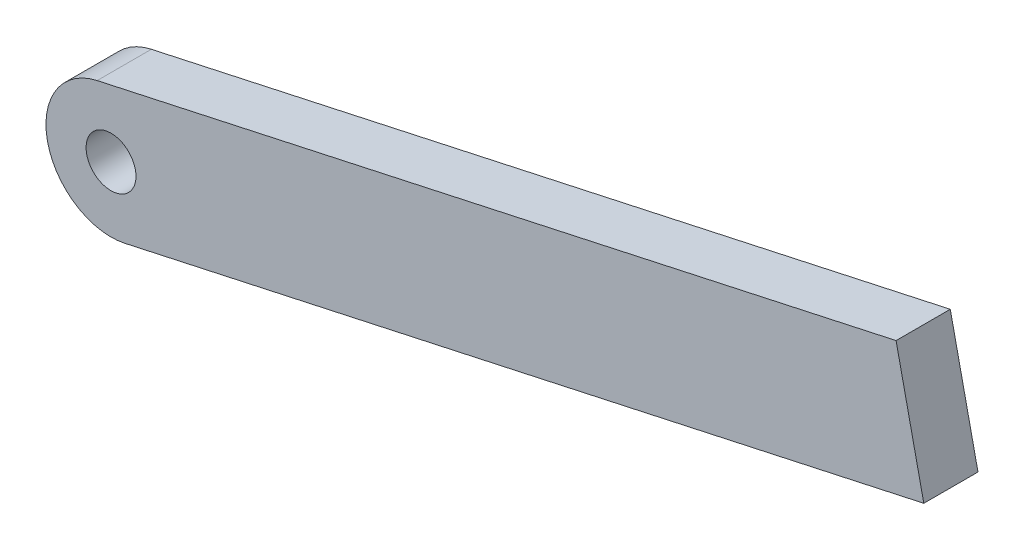
ISO-10303-21;
HEADER;
FILE_DESCRIPTION(('STEP AP214'),'2;1');
FILE_NAME('part.step','',(''),(''),'','','');
FILE_SCHEMA(('AUTOMOTIVE_DESIGN { 1 0 10303 214 1 1 1 1 }'));
ENDSEC;
DATA;
#1=APPLICATION_CONTEXT('core data for automotive mechanical design processes');
#2=APPLICATION_PROTOCOL_DEFINITION('international standard','automotive_design',2000,#1);
#3=PRODUCT_CONTEXT('',#1,'mechanical');
#4=PRODUCT('Part','Part','',(#3));
#5=PRODUCT_RELATED_PRODUCT_CATEGORY('part','',(#4));
#6=PRODUCT_DEFINITION_FORMATION('','',#4);
#7=PRODUCT_DEFINITION_CONTEXT('part definition',#1,'design');
#8=PRODUCT_DEFINITION('design','',#6,#7);
#9=PRODUCT_DEFINITION_SHAPE('','',#8);
#10=(LENGTH_UNIT() NAMED_UNIT(*) SI_UNIT(.MILLI.,.METRE.));
#11=(NAMED_UNIT(*) PLANE_ANGLE_UNIT() SI_UNIT($,.RADIAN.));
#12=(NAMED_UNIT(*) SI_UNIT($,.STERADIAN.) SOLID_ANGLE_UNIT());
#13=UNCERTAINTY_MEASURE_WITH_UNIT(LENGTH_MEASURE(1.E-05),#10,'distance_accuracy_value','');
#14=(GEOMETRIC_REPRESENTATION_CONTEXT(3) GLOBAL_UNCERTAINTY_ASSIGNED_CONTEXT((#13)) GLOBAL_UNIT_ASSIGNED_CONTEXT((#10,
#11,#12)) REPRESENTATION_CONTEXT('',''));
#15=CARTESIAN_POINT('',(0.,0.,0.));
#16=DIRECTION('',(0.,0.,1.));
#17=DIRECTION('',(1.,0.,0.));
#18=AXIS2_PLACEMENT_3D('',#15,#16,#17);
#19=CARTESIAN_POINT('',(194.487096888377,10.5650547502715,3.175));
#20=DIRECTION('',(-0.213148789764073,0.977019750784042,0.));
#21=DIRECTION('',(-0.977019750784042,-0.213148789764073,0.));
#22=AXIS2_PLACEMENT_3D('',#19,#20,#21);
#23=PLANE('',#22);
#24=DIRECTION('',(0.977019750784042,0.213148789764073,0.));
#25=VECTOR('',#24,1.);
#26=CARTESIAN_POINT('',(194.487096888377,10.5650547502715,0.));
#27=LINE('',#26,#25);
#28=CARTESIAN_POINT('',(194.487096888377,10.5650547502715,0.));
#29=VERTEX_POINT('',#28);
#30=CARTESIAN_POINT('',(241.287043977709,20.7750347175226,0.));
#31=VERTEX_POINT('',#30);
#32=EDGE_CURVE('E111',#29,#31,#27,.T.);
#33=ORIENTED_EDGE('',*,*,#32,.T.);
#34=DIRECTION('',(0.,0.,-1.));
#35=VECTOR('',#34,1.);
#36=CARTESIAN_POINT('',(241.287043977709,20.7750347175226,3.175));
#37=LINE('',#36,#35);
#38=CARTESIAN_POINT('',(241.287043977709,20.7750347175226,3.175));
#39=VERTEX_POINT('',#38);
#40=EDGE_CURVE('E64',#39,#31,#37,.T.);
#41=ORIENTED_EDGE('',*,*,#40,.F.);
#42=DIRECTION('',(0.977019750784042,0.213148789764073,0.));
#43=VECTOR('',#42,1.);
#44=CARTESIAN_POINT('',(194.487096888377,10.5650547502715,3.175));
#45=LINE('',#44,#43);
#46=CARTESIAN_POINT('',(194.487096888377,10.5650547502715,3.175));
#47=VERTEX_POINT('',#46);
#48=EDGE_CURVE('E99',#47,#39,#45,.T.);
#49=ORIENTED_EDGE('',*,*,#48,.F.);
#50=DIRECTION('',(0.,0.,-1.));
#51=VECTOR('',#50,1.);
#52=CARTESIAN_POINT('',(194.487096888377,10.5650547502715,3.175));
#53=LINE('',#52,#51);
#54=EDGE_CURVE('E12',#47,#29,#53,.T.);
#55=ORIENTED_EDGE('',*,*,#54,.T.);
#56=EDGE_LOOP('',(#33,#41,#49,#55));
#57=FACE_BOUND('',#56,.T.);
#58=ADVANCED_FACE('F54',(#57),#23,.F.);
#59=CARTESIAN_POINT('',(239.662850199707,28.219925218497,3.175));
#60=DIRECTION('',(0.977019750784042,0.213148789764074,0.));
#61=DIRECTION('',(-0.213148789764074,0.977019750784042,0.));
#62=AXIS2_PLACEMENT_3D('',#59,#60,#61);
#63=PLANE('',#62);
#64=DIRECTION('',(0.213148789764074,-0.977019750784041,0.));
#65=VECTOR('',#64,1.);
#66=CARTESIAN_POINT('',(239.662850199707,28.219925218497,0.));
#67=LINE('',#66,#65);
#68=CARTESIAN_POINT('',(239.662850199707,28.219925218497,0.));
#69=VERTEX_POINT('',#68);
#70=EDGE_CURVE('E122',#69,#31,#67,.T.);
#71=ORIENTED_EDGE('',*,*,#70,.F.);
#72=DIRECTION('',(0.,0.,-1.));
#73=VECTOR('',#72,1.);
#74=CARTESIAN_POINT('',(239.662850199707,28.219925218497,3.175));
#75=LINE('',#74,#73);
#76=CARTESIAN_POINT('',(239.662850199707,28.219925218497,3.175));
#77=VERTEX_POINT('',#76);
#78=EDGE_CURVE('E86',#77,#69,#75,.T.);
#79=ORIENTED_EDGE('',*,*,#78,.F.);
#80=DIRECTION('',(0.213148789764074,-0.977019750784041,0.));
#81=VECTOR('',#80,1.);
#82=CARTESIAN_POINT('',(239.662850199707,28.219925218497,3.175));
#83=LINE('',#82,#81);
#84=EDGE_CURVE('E104',#77,#39,#83,.T.);
#85=ORIENTED_EDGE('',*,*,#84,.T.);
#86=ORIENTED_EDGE('',*,*,#40,.T.);
#87=EDGE_LOOP('',(#71,#79,#85,#86));
#88=FACE_BOUND('',#87,.T.);
#89=ADVANCED_FACE('F115',(#88),#63,.T.);
#90=CARTESIAN_POINT('',(192.862903110375,18.0099452512459,3.175));
#91=DIRECTION('',(-0.213148789764073,0.977019750784042,0.));
#92=DIRECTION('',(-0.977019750784042,-0.213148789764073,0.));
#93=AXIS2_PLACEMENT_3D('',#90,#91,#92);
#94=PLANE('',#93);
#95=DIRECTION('',(0.977019750784042,0.213148789764073,0.));
#96=VECTOR('',#95,1.);
#97=CARTESIAN_POINT('',(192.862903110375,18.0099452512459,0.));
#98=LINE('',#97,#96);
#99=CARTESIAN_POINT('',(192.862903110375,18.0099452512459,0.));
#100=VERTEX_POINT('',#99);
#101=EDGE_CURVE('E107',#100,#69,#98,.T.);
#102=ORIENTED_EDGE('',*,*,#101,.F.);
#103=DIRECTION('',(0.,0.,-1.));
#104=VECTOR('',#103,1.);
#105=CARTESIAN_POINT('',(192.862903110375,18.0099452512459,3.175));
#106=LINE('',#105,#104);
#107=CARTESIAN_POINT('',(192.862903110375,18.0099452512459,3.175));
#108=VERTEX_POINT('',#107);
#109=EDGE_CURVE('E73',#108,#100,#106,.T.);
#110=ORIENTED_EDGE('',*,*,#109,.F.);
#111=DIRECTION('',(0.977019750784042,0.213148789764073,0.));
#112=VECTOR('',#111,1.);
#113=CARTESIAN_POINT('',(192.862903110375,18.0099452512459,3.175));
#114=LINE('',#113,#112);
#115=EDGE_CURVE('E116',#108,#77,#114,.T.);
#116=ORIENTED_EDGE('',*,*,#115,.T.);
#117=ORIENTED_EDGE('',*,*,#78,.T.);
#118=EDGE_LOOP('',(#102,#110,#116,#117));
#119=FACE_BOUND('',#118,.T.);
#120=ADVANCED_FACE('F146',(#119),#94,.T.);
#121=CARTESIAN_POINT('',(0.,0.,0.));
#122=DIRECTION('',(0.,0.,1.));
#123=DIRECTION('',(1.,0.,0.));
#124=AXIS2_PLACEMENT_3D('',#121,#122,#123);
#125=PLANE('',#124);
#126=CARTESIAN_POINT('',(193.674999999376,14.2875000007587,0.));
#127=DIRECTION('',(0.,0.,1.));
#128=DIRECTION('',(1.,0.,0.));
#129=AXIS2_PLACEMENT_3D('',#126,#127,#128);
#130=CIRCLE('',#129,1.4605);
#131=CARTESIAN_POINT('',(195.135499999376,14.2875000007587,0.));
#132=VERTEX_POINT('',#131);
#133=EDGE_CURVE('E127',#132,#132,#130,.T.);
#134=ORIENTED_EDGE('',*,*,#133,.T.);
#135=EDGE_LOOP('',(#134));
#136=FACE_BOUND('',#135,.T.);
#137=ORIENTED_EDGE('',*,*,#32,.F.);
#138=CARTESIAN_POINT('',(193.674999999376,14.2875000007587,0.));
#139=DIRECTION('',(0.,0.,1.));
#140=DIRECTION('',(1.,0.,0.));
#141=AXIS2_PLACEMENT_3D('',#138,#139,#140);
#142=CIRCLE('',#141,3.81000000000001);
#143=EDGE_CURVE('E58',#100,#29,#142,.T.);
#144=ORIENTED_EDGE('',*,*,#143,.F.);
#145=ORIENTED_EDGE('',*,*,#101,.T.);
#146=ORIENTED_EDGE('',*,*,#70,.T.);
#147=EDGE_LOOP('',(#137,#144,#145,#146));
#148=FACE_BOUND('',#147,.T.);
#149=ADVANCED_FACE('F139',(#136,#148),#125,.F.);
#150=CARTESIAN_POINT('',(0.,0.,3.175));
#151=DIRECTION('',(0.,0.,1.));
#152=DIRECTION('',(1.,0.,0.));
#153=AXIS2_PLACEMENT_3D('',#150,#151,#152);
#154=PLANE('',#153);
#155=CARTESIAN_POINT('',(193.674999999376,14.2875000007587,3.175));
#156=DIRECTION('',(0.,0.,1.));
#157=DIRECTION('',(1.,0.,0.));
#158=AXIS2_PLACEMENT_3D('',#155,#156,#157);
#159=CIRCLE('',#158,1.4605);
#160=CARTESIAN_POINT('',(195.135499999376,14.2875000007587,3.175));
#161=VERTEX_POINT('',#160);
#162=EDGE_CURVE('E129',#161,#161,#159,.T.);
#163=ORIENTED_EDGE('',*,*,#162,.F.);
#164=EDGE_LOOP('',(#163));
#165=FACE_BOUND('',#164,.T.);
#166=ORIENTED_EDGE('',*,*,#115,.F.);
#167=CARTESIAN_POINT('',(193.674999999376,14.2875000007587,3.175));
#168=DIRECTION('',(0.,0.,1.));
#169=DIRECTION('',(1.,0.,0.));
#170=AXIS2_PLACEMENT_3D('',#167,#168,#169);
#171=CIRCLE('',#170,3.81000000000001);
#172=EDGE_CURVE('E105',#108,#47,#171,.T.);
#173=ORIENTED_EDGE('',*,*,#172,.T.);
#174=ORIENTED_EDGE('',*,*,#48,.T.);
#175=ORIENTED_EDGE('',*,*,#84,.F.);
#176=EDGE_LOOP('',(#166,#173,#174,#175));
#177=FACE_BOUND('',#176,.T.);
#178=ADVANCED_FACE('F102',(#165,#177),#154,.T.);
#179=CARTESIAN_POINT('',(193.674999999376,14.2875000007587,3.175));
#180=DIRECTION('',(0.,0.,-1.));
#181=DIRECTION('',(-1.,0.,0.));
#182=AXIS2_PLACEMENT_3D('',#179,#180,#181);
#183=CYLINDRICAL_SURFACE('',#182,3.81000000000001);
#184=ORIENTED_EDGE('',*,*,#143,.T.);
#185=ORIENTED_EDGE('',*,*,#54,.F.);
#186=ORIENTED_EDGE('',*,*,#172,.F.);
#187=ORIENTED_EDGE('',*,*,#109,.T.);
#188=EDGE_LOOP('',(#184,#185,#186,#187));
#189=FACE_BOUND('',#188,.T.);
#190=ADVANCED_FACE('F56',(#189),#183,.T.);
#191=CARTESIAN_POINT('',(193.674999999376,14.2875000007587,0.));
#192=DIRECTION('',(0.,0.,1.));
#193=DIRECTION('',(1.,0.,0.));
#194=AXIS2_PLACEMENT_3D('',#191,#192,#193);
#195=CYLINDRICAL_SURFACE('',#194,1.4605);
#196=ORIENTED_EDGE('',*,*,#133,.F.);
#197=EDGE_LOOP('',(#196));
#198=FACE_BOUND('',#197,.T.);
#199=ORIENTED_EDGE('',*,*,#162,.T.);
#200=EDGE_LOOP('',(#199));
#201=FACE_BOUND('',#200,.T.);
#202=ADVANCED_FACE('F136',(#198,#201),#195,.F.);
#203=CLOSED_SHELL('',(#58,#89,#120,#149,#178,#190,#202));
#204=MANIFOLD_SOLID_BREP('B2',#203);
#205=ADVANCED_BREP_SHAPE_REPRESENTATION('',(#18,#204),#14);
#206=SHAPE_DEFINITION_REPRESENTATION(#9,#205);
ENDSEC;
END-ISO-10303-21;
